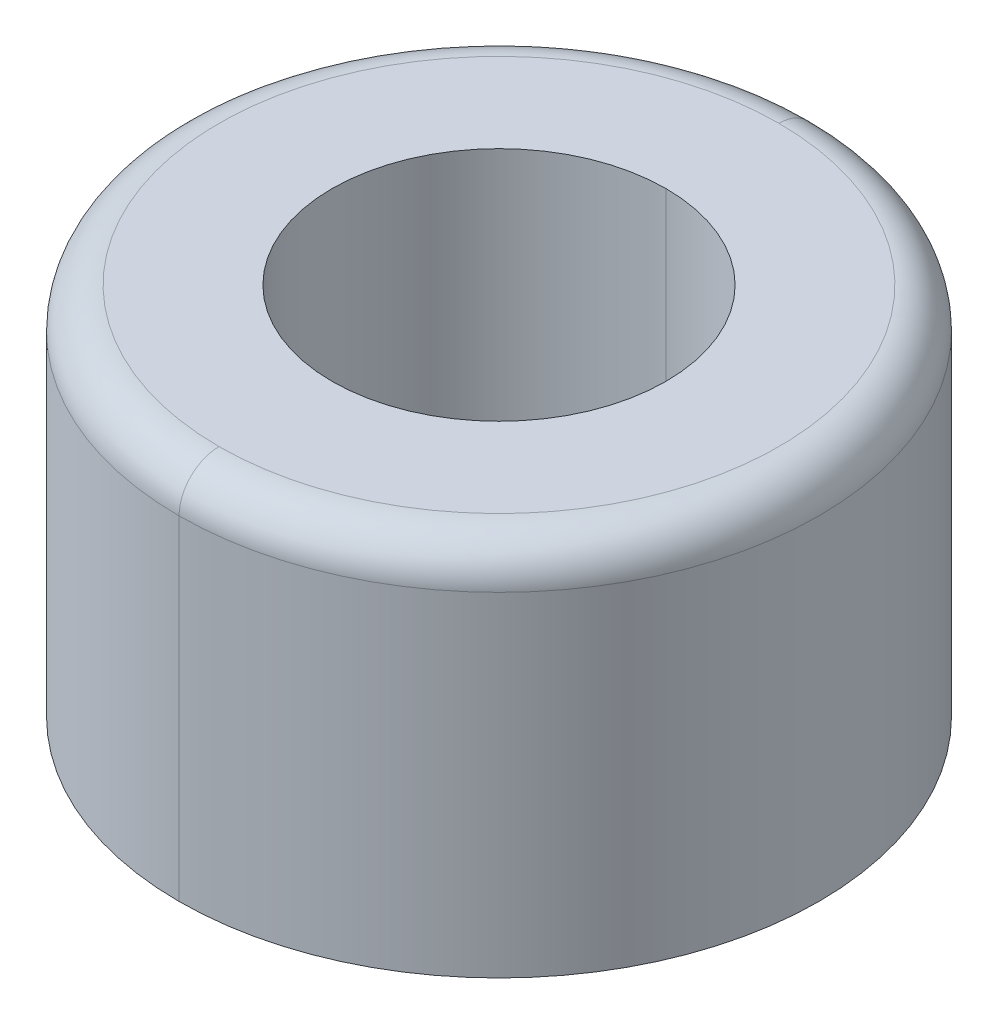
ISO-10303-21;
HEADER;
FILE_DESCRIPTION(('STEP AP214'),'2;1');
FILE_NAME('part.step','',(''),(''),'','','');
FILE_SCHEMA(('AUTOMOTIVE_DESIGN { 1 0 10303 214 1 1 1 1 }'));
ENDSEC;
DATA;
#1=APPLICATION_CONTEXT('core data for automotive mechanical design processes');
#2=APPLICATION_PROTOCOL_DEFINITION('international standard','automotive_design',2000,#1);
#3=PRODUCT_CONTEXT('',#1,'mechanical');
#4=PRODUCT('Part','Part','',(#3));
#5=PRODUCT_RELATED_PRODUCT_CATEGORY('part','',(#4));
#6=PRODUCT_DEFINITION_FORMATION('','',#4);
#7=PRODUCT_DEFINITION_CONTEXT('part definition',#1,'design');
#8=PRODUCT_DEFINITION('design','',#6,#7);
#9=PRODUCT_DEFINITION_SHAPE('','',#8);
#10=(LENGTH_UNIT() NAMED_UNIT(*) SI_UNIT(.MILLI.,.METRE.));
#11=(NAMED_UNIT(*) PLANE_ANGLE_UNIT() SI_UNIT($,.RADIAN.));
#12=(NAMED_UNIT(*) SI_UNIT($,.STERADIAN.) SOLID_ANGLE_UNIT());
#13=UNCERTAINTY_MEASURE_WITH_UNIT(LENGTH_MEASURE(1.E-05),#10,'distance_accuracy_value','');
#14=(GEOMETRIC_REPRESENTATION_CONTEXT(3) GLOBAL_UNCERTAINTY_ASSIGNED_CONTEXT((#13)) GLOBAL_UNIT_ASSIGNED_CONTEXT((#10,
#11,#12)) REPRESENTATION_CONTEXT('',''));
#15=CARTESIAN_POINT('',(0.,0.,0.));
#16=DIRECTION('',(0.,0.,1.));
#17=DIRECTION('',(1.,0.,0.));
#18=AXIS2_PLACEMENT_3D('',#15,#16,#17);
#19=CARTESIAN_POINT('',(0.,2.3749,0.));
#20=DIRECTION('',(0.,-1.,0.));
#21=DIRECTION('',(0.,0.,-1.));
#22=AXIS2_PLACEMENT_3D('',#19,#20,#21);
#23=CYLINDRICAL_SURFACE('',#22,2.1209);
#24=DIRECTION('',(0.,-1.,0.));
#25=VECTOR('',#24,1.);
#26=CARTESIAN_POINT('',(0.,2.3749,2.1209));
#27=LINE('',#26,#25);
#28=CARTESIAN_POINT('',(0.,2.3749,2.1209));
#29=VERTEX_POINT('',#28);
#30=CARTESIAN_POINT('',(0.,-2.3749,2.1209));
#31=VERTEX_POINT('',#30);
#32=EDGE_CURVE('E27',#29,#31,#27,.T.);
#33=ORIENTED_EDGE('',*,*,#32,.F.);
#34=CARTESIAN_POINT('',(0.,2.3749,0.));
#35=DIRECTION('',(0.,1.,0.));
#36=DIRECTION('',(0.,0.,1.));
#37=AXIS2_PLACEMENT_3D('',#34,#35,#36);
#38=CIRCLE('',#37,2.1209);
#39=CARTESIAN_POINT('',(0.,2.3749,-2.1209));
#40=VERTEX_POINT('',#39);
#41=EDGE_CURVE('E116',#29,#40,#38,.T.);
#42=ORIENTED_EDGE('',*,*,#41,.T.);
#43=DIRECTION('',(0.,-1.,0.));
#44=VECTOR('',#43,1.);
#45=CARTESIAN_POINT('',(0.,2.3749,-2.1209));
#46=LINE('',#45,#44);
#47=CARTESIAN_POINT('',(0.,-2.3749,-2.1209));
#48=VERTEX_POINT('',#47);
#49=EDGE_CURVE('E10',#40,#48,#46,.T.);
#50=ORIENTED_EDGE('',*,*,#49,.T.);
#51=CARTESIAN_POINT('',(0.,-2.3749,0.));
#52=DIRECTION('',(0.,1.,0.));
#53=DIRECTION('',(0.,0.,1.));
#54=AXIS2_PLACEMENT_3D('',#51,#52,#53);
#55=CIRCLE('',#54,2.1209);
#56=EDGE_CURVE('E117',#31,#48,#55,.T.);
#57=ORIENTED_EDGE('',*,*,#56,.F.);
#58=EDGE_LOOP('',(#33,#42,#50,#57));
#59=FACE_BOUND('',#58,.T.);
#60=ADVANCED_FACE('F16',(#59),#23,.F.);
#61=CARTESIAN_POINT('',(0.,2.3749,0.));
#62=DIRECTION('',(0.,-1.,0.));
#63=DIRECTION('',(0.,0.,-1.));
#64=AXIS2_PLACEMENT_3D('',#61,#62,#63);
#65=CYLINDRICAL_SURFACE('',#64,2.1209);
#66=CARTESIAN_POINT('',(0.,2.3749,0.));
#67=DIRECTION('',(0.,1.,0.));
#68=DIRECTION('',(0.,0.,1.));
#69=AXIS2_PLACEMENT_3D('',#66,#67,#68);
#70=CIRCLE('',#69,2.1209);
#71=EDGE_CURVE('E113',#40,#29,#70,.T.);
#72=ORIENTED_EDGE('',*,*,#71,.T.);
#73=ORIENTED_EDGE('',*,*,#32,.T.);
#74=CARTESIAN_POINT('',(0.,-2.3749,0.));
#75=DIRECTION('',(0.,1.,0.));
#76=DIRECTION('',(0.,0.,1.));
#77=AXIS2_PLACEMENT_3D('',#74,#75,#76);
#78=CIRCLE('',#77,2.1209);
#79=EDGE_CURVE('E93',#48,#31,#78,.T.);
#80=ORIENTED_EDGE('',*,*,#79,.F.);
#81=ORIENTED_EDGE('',*,*,#49,.F.);
#82=EDGE_LOOP('',(#72,#73,#80,#81));
#83=FACE_BOUND('',#82,.T.);
#84=ADVANCED_FACE('F195',(#83),#65,.F.);
#85=CARTESIAN_POINT('',(0.,2.3749,0.));
#86=DIRECTION('',(0.,1.,0.));
#87=DIRECTION('',(1.,0.,0.));
#88=AXIS2_PLACEMENT_3D('',#85,#86,#87);
#89=PLANE('',#88);
#90=ORIENTED_EDGE('',*,*,#71,.F.);
#91=ORIENTED_EDGE('',*,*,#41,.F.);
#92=EDGE_LOOP('',(#90,#91));
#93=FACE_BOUND('',#92,.T.);
#94=CARTESIAN_POINT('',(0.,2.3749,0.));
#95=DIRECTION('',(0.,1.,0.));
#96=DIRECTION('',(0.,0.,1.));
#97=AXIS2_PLACEMENT_3D('',#94,#95,#96);
#98=CIRCLE('',#97,3.556);
#99=CARTESIAN_POINT('',(0.,2.3749,3.556));
#100=VERTEX_POINT('',#99);
#101=CARTESIAN_POINT('',(0.,2.3749,-3.556));
#102=VERTEX_POINT('',#101);
#103=EDGE_CURVE('E64',#100,#102,#98,.T.);
#104=ORIENTED_EDGE('',*,*,#103,.T.);
#105=CARTESIAN_POINT('',(0.,2.3749,0.));
#106=DIRECTION('',(0.,1.,0.));
#107=DIRECTION('',(0.,0.,1.));
#108=AXIS2_PLACEMENT_3D('',#105,#106,#107);
#109=CIRCLE('',#108,3.556);
#110=EDGE_CURVE('E20',#102,#100,#109,.T.);
#111=ORIENTED_EDGE('',*,*,#110,.T.);
#112=EDGE_LOOP('',(#104,#111));
#113=FACE_BOUND('',#112,.T.);
#114=ADVANCED_FACE('F18',(#93,#113),#89,.T.);
#115=CARTESIAN_POINT('',(0.,1.8669,0.));
#116=DIRECTION('',(0.,1.,0.));
#117=DIRECTION('',(0.,0.,1.));
#118=AXIS2_PLACEMENT_3D('',#115,#116,#117);
#119=TOROIDAL_SURFACE('',#118,3.556,0.508);
#120=CARTESIAN_POINT('',(0.,1.8669,0.));
#121=DIRECTION('',(0.,-1.,0.));
#122=DIRECTION('',(0.,0.,1.));
#123=AXIS2_PLACEMENT_3D('',#120,#121,#122);
#124=CIRCLE('',#123,4.064);
#125=CARTESIAN_POINT('',(0.,1.8669,-4.064));
#126=VERTEX_POINT('',#125);
#127=CARTESIAN_POINT('',(0.,1.8669,4.064));
#128=VERTEX_POINT('',#127);
#129=EDGE_CURVE('E121',#126,#128,#124,.T.);
#130=ORIENTED_EDGE('',*,*,#129,.F.);
#131=CARTESIAN_POINT('',(0.,1.8669,-3.556));
#132=DIRECTION('',(1.,0.,0.));
#133=DIRECTION('',(0.,0.,-1.));
#134=AXIS2_PLACEMENT_3D('',#131,#132,#133);
#135=CIRCLE('',#134,0.508);
#136=EDGE_CURVE('E99',#126,#102,#135,.T.);
#137=ORIENTED_EDGE('',*,*,#136,.T.);
#138=ORIENTED_EDGE('',*,*,#103,.F.);
#139=CARTESIAN_POINT('',(0.,1.8669,3.556));
#140=DIRECTION('',(-1.,0.,0.));
#141=DIRECTION('',(0.,0.,1.));
#142=AXIS2_PLACEMENT_3D('',#139,#140,#141);
#143=CIRCLE('',#142,0.508);
#144=EDGE_CURVE('E126',#128,#100,#143,.T.);
#145=ORIENTED_EDGE('',*,*,#144,.F.);
#146=EDGE_LOOP('',(#130,#137,#138,#145));
#147=FACE_BOUND('',#146,.T.);
#148=ADVANCED_FACE('F207',(#147),#119,.T.);
#149=CARTESIAN_POINT('',(0.,2.3749,0.));
#150=DIRECTION('',(0.,-1.,0.));
#151=DIRECTION('',(0.,0.,-1.));
#152=AXIS2_PLACEMENT_3D('',#149,#150,#151);
#153=CYLINDRICAL_SURFACE('',#152,4.064);
#154=ORIENTED_EDGE('',*,*,#129,.T.);
#155=DIRECTION('',(0.,-1.,0.));
#156=VECTOR('',#155,1.);
#157=CARTESIAN_POINT('',(0.,2.3749,4.064));
#158=LINE('',#157,#156);
#159=CARTESIAN_POINT('',(0.,-2.3749,4.064));
#160=VERTEX_POINT('',#159);
#161=EDGE_CURVE('E89',#128,#160,#158,.T.);
#162=ORIENTED_EDGE('',*,*,#161,.T.);
#163=CARTESIAN_POINT('',(0.,-2.3749,0.));
#164=DIRECTION('',(0.,1.,0.));
#165=DIRECTION('',(0.,0.,1.));
#166=AXIS2_PLACEMENT_3D('',#163,#164,#165);
#167=CIRCLE('',#166,4.064);
#168=CARTESIAN_POINT('',(0.,-2.3749,-4.064));
#169=VERTEX_POINT('',#168);
#170=EDGE_CURVE('E81',#160,#169,#167,.T.);
#171=ORIENTED_EDGE('',*,*,#170,.T.);
#172=DIRECTION('',(0.,-1.,0.));
#173=VECTOR('',#172,1.);
#174=CARTESIAN_POINT('',(0.,2.3749,-4.064));
#175=LINE('',#174,#173);
#176=EDGE_CURVE('E86',#126,#169,#175,.T.);
#177=ORIENTED_EDGE('',*,*,#176,.F.);
#178=EDGE_LOOP('',(#154,#162,#171,#177));
#179=FACE_BOUND('',#178,.T.);
#180=ADVANCED_FACE('F84',(#179),#153,.T.);
#181=CARTESIAN_POINT('',(0.,-2.3749,0.));
#182=DIRECTION('',(0.,1.,0.));
#183=DIRECTION('',(1.,0.,0.));
#184=AXIS2_PLACEMENT_3D('',#181,#182,#183);
#185=PLANE('',#184);
#186=ORIENTED_EDGE('',*,*,#79,.T.);
#187=ORIENTED_EDGE('',*,*,#56,.T.);
#188=EDGE_LOOP('',(#186,#187));
#189=FACE_BOUND('',#188,.T.);
#190=CARTESIAN_POINT('',(0.,-2.3749,0.));
#191=DIRECTION('',(0.,1.,0.));
#192=DIRECTION('',(0.,0.,1.));
#193=AXIS2_PLACEMENT_3D('',#190,#191,#192);
#194=CIRCLE('',#193,4.064);
#195=EDGE_CURVE('E95',#169,#160,#194,.T.);
#196=ORIENTED_EDGE('',*,*,#195,.F.);
#197=ORIENTED_EDGE('',*,*,#170,.F.);
#198=EDGE_LOOP('',(#196,#197));
#199=FACE_BOUND('',#198,.T.);
#200=ADVANCED_FACE('F96',(#189,#199),#185,.F.);
#201=CARTESIAN_POINT('',(0.,1.8669,0.));
#202=DIRECTION('',(0.,1.,0.));
#203=DIRECTION('',(0.,0.,1.));
#204=AXIS2_PLACEMENT_3D('',#201,#202,#203);
#205=TOROIDAL_SURFACE('',#204,3.556,0.508);
#206=ORIENTED_EDGE('',*,*,#136,.F.);
#207=CARTESIAN_POINT('',(0.,1.8669,0.));
#208=DIRECTION('',(0.,-1.,0.));
#209=DIRECTION('',(0.,0.,1.));
#210=AXIS2_PLACEMENT_3D('',#207,#208,#209);
#211=CIRCLE('',#210,4.064);
#212=EDGE_CURVE('E103',#128,#126,#211,.T.);
#213=ORIENTED_EDGE('',*,*,#212,.F.);
#214=ORIENTED_EDGE('',*,*,#144,.T.);
#215=ORIENTED_EDGE('',*,*,#110,.F.);
#216=EDGE_LOOP('',(#206,#213,#214,#215));
#217=FACE_BOUND('',#216,.T.);
#218=ADVANCED_FACE('F212',(#217),#205,.T.);
#219=CARTESIAN_POINT('',(0.,2.3749,0.));
#220=DIRECTION('',(0.,-1.,0.));
#221=DIRECTION('',(0.,0.,-1.));
#222=AXIS2_PLACEMENT_3D('',#219,#220,#221);
#223=CYLINDRICAL_SURFACE('',#222,4.064);
#224=ORIENTED_EDGE('',*,*,#161,.F.);
#225=ORIENTED_EDGE('',*,*,#212,.T.);
#226=ORIENTED_EDGE('',*,*,#176,.T.);
#227=ORIENTED_EDGE('',*,*,#195,.T.);
#228=EDGE_LOOP('',(#224,#225,#226,#227));
#229=FACE_BOUND('',#228,.T.);
#230=ADVANCED_FACE('F101',(#229),#223,.T.);
#231=CLOSED_SHELL('',(#60,#84,#114,#148,#180,#200,#218,#230));
#232=MANIFOLD_SOLID_BREP('B1',#231);
#233=ADVANCED_BREP_SHAPE_REPRESENTATION('',(#18,#232),#14);
#234=SHAPE_DEFINITION_REPRESENTATION(#9,#233);
ENDSEC;
END-ISO-10303-21;
